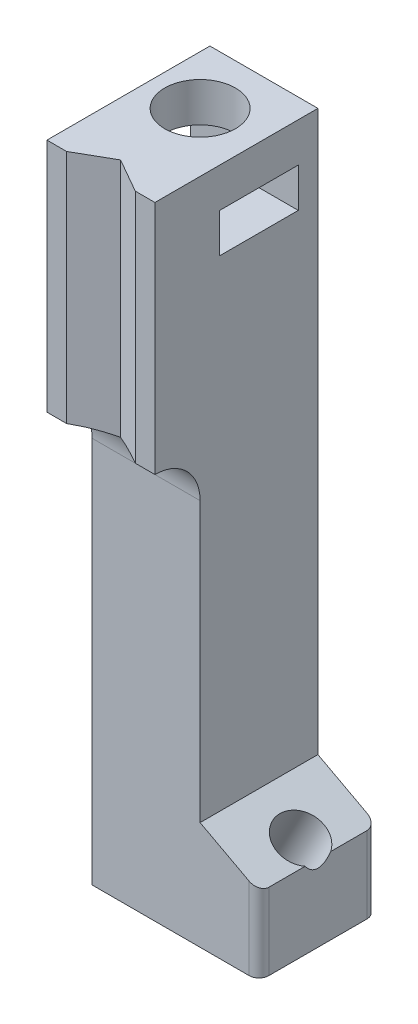
ISO-10303-21;
HEADER;
FILE_DESCRIPTION(('STEP AP214'),'2;1');
FILE_NAME('part.step','',(''),(''),'','','');
FILE_SCHEMA(('AUTOMOTIVE_DESIGN { 1 0 10303 214 1 1 1 1 }'));
ENDSEC;
DATA;
#1=APPLICATION_CONTEXT('core data for automotive mechanical design processes');
#2=APPLICATION_PROTOCOL_DEFINITION('international standard','automotive_design',2000,#1);
#3=PRODUCT_CONTEXT('',#1,'mechanical');
#4=PRODUCT('Part','Part','',(#3));
#5=PRODUCT_RELATED_PRODUCT_CATEGORY('part','',(#4));
#6=PRODUCT_DEFINITION_FORMATION('','',#4);
#7=PRODUCT_DEFINITION_CONTEXT('part definition',#1,'design');
#8=PRODUCT_DEFINITION('design','',#6,#7);
#9=PRODUCT_DEFINITION_SHAPE('','',#8);
#10=(LENGTH_UNIT() NAMED_UNIT(*) SI_UNIT(.MILLI.,.METRE.));
#11=(NAMED_UNIT(*) PLANE_ANGLE_UNIT() SI_UNIT($,.RADIAN.));
#12=(NAMED_UNIT(*) SI_UNIT($,.STERADIAN.) SOLID_ANGLE_UNIT());
#13=UNCERTAINTY_MEASURE_WITH_UNIT(LENGTH_MEASURE(1.E-05),#10,'distance_accuracy_value','');
#14=(GEOMETRIC_REPRESENTATION_CONTEXT(3) GLOBAL_UNCERTAINTY_ASSIGNED_CONTEXT((#13)) GLOBAL_UNIT_ASSIGNED_CONTEXT((#10,
#11,#12)) REPRESENTATION_CONTEXT('',''));
#15=CARTESIAN_POINT('',(0.,0.,0.));
#16=DIRECTION('',(0.,0.,1.));
#17=DIRECTION('',(1.,0.,0.));
#18=AXIS2_PLACEMENT_3D('',#15,#16,#17);
#19=CARTESIAN_POINT('',(0.,0.,2.64999999996392));
#20=DIRECTION('',(0.,0.,-1.));
#21=DIRECTION('',(-1.,0.,0.));
#22=AXIS2_PLACEMENT_3D('',#19,#20,#21);
#23=PLANE('',#22);
#24=DIRECTION('',(1.,0.,0.));
#25=VECTOR('',#24,1.);
#26=CARTESIAN_POINT('',(4.00000000001017,18.75,2.64999999996392));
#27=LINE('',#26,#25);
#28=CARTESIAN_POINT('',(1.25000000001018,18.75,2.64999999996392));
#29=VERTEX_POINT('',#28);
#30=CARTESIAN_POINT('',(1.75000000001017,18.75,2.64999999996392));
#31=VERTEX_POINT('',#30);
#32=EDGE_CURVE('E375',#29,#31,#27,.T.);
#33=ORIENTED_EDGE('',*,*,#32,.T.);
#34=DIRECTION('',(0.,1.,0.));
#35=VECTOR('',#34,1.);
#36=CARTESIAN_POINT('',(1.75000000001017,7.75,2.64999999996392));
#37=LINE('',#36,#35);
#38=CARTESIAN_POINT('',(1.75000000001017,24.75,2.64999999996392));
#39=VERTEX_POINT('',#38);
#40=EDGE_CURVE('E481',#31,#39,#37,.T.);
#41=ORIENTED_EDGE('',*,*,#40,.T.);
#42=DIRECTION('',(1.,0.,0.));
#43=VECTOR('',#42,1.);
#44=CARTESIAN_POINT('',(1.25000000001018,24.75,2.64999999996392));
#45=LINE('',#44,#43);
#46=CARTESIAN_POINT('',(1.25000000001018,24.75,2.64999999996392));
#47=VERTEX_POINT('',#46);
#48=EDGE_CURVE('E356',#47,#39,#45,.T.);
#49=ORIENTED_EDGE('',*,*,#48,.F.);
#50=DIRECTION('',(0.,-1.,0.));
#51=VECTOR('',#50,1.);
#52=CARTESIAN_POINT('',(1.25000000001018,23.75,2.64999999996392));
#53=LINE('',#52,#51);
#54=EDGE_CURVE('E371',#47,#29,#53,.T.);
#55=ORIENTED_EDGE('',*,*,#54,.T.);
#56=EDGE_LOOP('',(#33,#41,#49,#55));
#57=FACE_BOUND('',#56,.T.);
#58=ADVANCED_FACE('F39',(#57),#23,.F.);
#59=CARTESIAN_POINT('',(1.25000000001018,23.75,1.49999999996392));
#60=DIRECTION('',(0.,0.,-1.));
#61=DIRECTION('',(0.,1.,0.));
#62=AXIS2_PLACEMENT_3D('',#59,#60,#61);
#63=PLANE('',#62);
#64=DIRECTION('',(1.,0.,0.));
#65=VECTOR('',#64,1.);
#66=CARTESIAN_POINT('',(1.25000000001017,7.75,1.49999999996392));
#67=LINE('',#66,#65);
#68=CARTESIAN_POINT('',(1.25000000001017,7.75,1.49999999996392));
#69=VERTEX_POINT('',#68);
#70=CARTESIAN_POINT('',(5.25000000001017,7.75,1.49999999996392));
#71=VERTEX_POINT('',#70);
#72=EDGE_CURVE('E378',#69,#71,#67,.T.);
#73=ORIENTED_EDGE('',*,*,#72,.T.);
#74=DIRECTION('',(0.,-1.,0.));
#75=VECTOR('',#74,1.);
#76=CARTESIAN_POINT('',(5.25000000001017,9.7,1.49999999996392));
#77=LINE('',#76,#75);
#78=CARTESIAN_POINT('',(5.25000000001017,9.83333333333333,1.49999999996392));
#79=VERTEX_POINT('',#78);
#80=EDGE_CURVE('E427',#71,#79,#77,.F.);
#81=ORIENTED_EDGE('',*,*,#80,.T.);
#82=DIRECTION('',(-0.882352941176471,0.470588235294117,0.));
#83=VECTOR('',#82,1.);
#84=CARTESIAN_POINT('',(5.50000000001017,9.7,1.49999999996392));
#85=LINE('',#84,#83);
#86=CARTESIAN_POINT('',(4.00000000001017,10.5,1.49999999996392));
#87=VERTEX_POINT('',#86);
#88=EDGE_CURVE('E393',#79,#87,#85,.T.);
#89=ORIENTED_EDGE('',*,*,#88,.T.);
#90=DIRECTION('',(0.,1.,0.));
#91=VECTOR('',#90,1.);
#92=CARTESIAN_POINT('',(4.00000000001017,21.75,1.49999999996392));
#93=LINE('',#92,#91);
#94=CARTESIAN_POINT('',(4.00000000001017,17.6,1.49999999996392));
#95=VERTEX_POINT('',#94);
#96=EDGE_CURVE('E238',#87,#95,#93,.T.);
#97=ORIENTED_EDGE('',*,*,#96,.T.);
#98=DIRECTION('',(1.,0.,0.));
#99=VECTOR('',#98,1.);
#100=CARTESIAN_POINT('',(1.25000000001018,17.6,1.49999999996392));
#101=LINE('',#100,#99);
#102=CARTESIAN_POINT('',(1.25000000001018,17.6,1.49999999996392));
#103=VERTEX_POINT('',#102);
#104=EDGE_CURVE('E391',#95,#103,#101,.F.);
#105=ORIENTED_EDGE('',*,*,#104,.T.);
#106=DIRECTION('',(0.,-1.,0.));
#107=VECTOR('',#106,1.);
#108=CARTESIAN_POINT('',(1.25000000001018,23.75,1.49999999996392));
#109=LINE('',#108,#107);
#110=EDGE_CURVE('E381',#103,#69,#109,.T.);
#111=ORIENTED_EDGE('',*,*,#110,.T.);
#112=EDGE_LOOP('',(#73,#81,#89,#97,#105,#111));
#113=FACE_BOUND('',#112,.T.);
#114=ADVANCED_FACE('F277',(#113),#63,.F.);
#115=CARTESIAN_POINT('',(2.50000000000001,23.25,0.));
#116=DIRECTION('',(0.,1.,0.));
#117=DIRECTION('',(0.,0.,-1.));
#118=AXIS2_PLACEMENT_3D('',#115,#116,#117);
#119=ELLIPSE('',#118,1.3,0.65);
#120=DIRECTION('',(0.,-1.,0.));
#121=VECTOR('',#120,1.);
#122=SURFACE_OF_LINEAR_EXTRUSION('',#119,#121);
#123=DIRECTION('',(0.,-1.,0.));
#124=VECTOR('',#123,1.);
#125=CARTESIAN_POINT('',(2.91533119316764,23.25,0.999999999963918));
#126=LINE('',#125,#124);
#127=CARTESIAN_POINT('',(2.91533119316764,22.75,0.999999999963918));
#128=VERTEX_POINT('',#127);
#129=CARTESIAN_POINT('',(2.91533119316764,23.25,0.999999999963918));
#130=VERTEX_POINT('',#129);
#131=EDGE_CURVE('E525',#128,#130,#126,.F.);
#132=ORIENTED_EDGE('',*,*,#131,.F.);
#133=CARTESIAN_POINT('',(2.50000000000001,22.75,0.));
#134=DIRECTION('',(0.,1.,0.));
#135=DIRECTION('',(0.,0.,-1.));
#136=AXIS2_PLACEMENT_3D('',#133,#134,#135);
#137=ELLIPSE('',#136,1.3,0.65);
#138=CARTESIAN_POINT('',(2.08466880683238,22.75,0.999999999963918));
#139=VERTEX_POINT('',#138);
#140=EDGE_CURVE('E801',#139,#128,#137,.T.);
#141=ORIENTED_EDGE('',*,*,#140,.F.);
#142=DIRECTION('',(0.,-1.,0.));
#143=VECTOR('',#142,1.);
#144=CARTESIAN_POINT('',(2.08466880683238,23.25,0.999999999963918));
#145=LINE('',#144,#143);
#146=CARTESIAN_POINT('',(2.08466880683238,23.25,0.999999999963918));
#147=VERTEX_POINT('',#146);
#148=EDGE_CURVE('E523',#147,#139,#145,.T.);
#149=ORIENTED_EDGE('',*,*,#148,.F.);
#150=EDGE_CURVE('E264',#147,#130,#119,.T.);
#151=ORIENTED_EDGE('',*,*,#150,.T.);
#152=EDGE_LOOP('',(#132,#141,#149,#151));
#153=FACE_BOUND('',#152,.T.);
#154=ADVANCED_FACE('F272',(#153),#122,.T.);
#155=DIRECTION('',(0.,-1.,0.));
#156=VECTOR('',#155,1.);
#157=CARTESIAN_POINT('',(2.08466880687584,23.25,-1.00000000003608));
#158=LINE('',#157,#156);
#159=CARTESIAN_POINT('',(2.08466880687584,22.75,-1.00000000003608));
#160=VERTEX_POINT('',#159);
#161=CARTESIAN_POINT('',(2.08466880687584,23.25,-1.00000000003608));
#162=VERTEX_POINT('',#161);
#163=EDGE_CURVE('E532',#160,#162,#158,.F.);
#164=ORIENTED_EDGE('',*,*,#163,.F.);
#165=CARTESIAN_POINT('',(2.91533119312418,22.75,-1.00000000003608));
#166=VERTEX_POINT('',#165);
#167=EDGE_CURVE('E263',#166,#160,#137,.T.);
#168=ORIENTED_EDGE('',*,*,#167,.F.);
#169=DIRECTION('',(0.,-1.,0.));
#170=VECTOR('',#169,1.);
#171=CARTESIAN_POINT('',(2.91533119312418,23.25,-1.00000000003608));
#172=LINE('',#171,#170);
#173=CARTESIAN_POINT('',(2.91533119312418,23.25,-1.00000000003608));
#174=VERTEX_POINT('',#173);
#175=EDGE_CURVE('E530',#174,#166,#172,.T.);
#176=ORIENTED_EDGE('',*,*,#175,.F.);
#177=EDGE_CURVE('E269',#174,#162,#119,.T.);
#178=ORIENTED_EDGE('',*,*,#177,.T.);
#179=EDGE_LOOP('',(#164,#168,#176,#178));
#180=FACE_BOUND('',#179,.T.);
#181=ADVANCED_FACE('F276',(#180),#122,.T.);
#182=CARTESIAN_POINT('',(0.,22.75,0.));
#183=DIRECTION('',(0.,1.,0.));
#184=DIRECTION('',(-1.,0.,0.));
#185=AXIS2_PLACEMENT_3D('',#182,#183,#184);
#186=PLANE('',#185);
#187=ORIENTED_EDGE('',*,*,#140,.T.);
#188=DIRECTION('',(-1.,0.,0.));
#189=VECTOR('',#188,1.);
#190=CARTESIAN_POINT('',(5.50000000001017,22.75,0.999999999963918));
#191=LINE('',#190,#189);
#192=CARTESIAN_POINT('',(4.00000000001017,22.75,0.999999999963918));
#193=VERTEX_POINT('',#192);
#194=EDGE_CURVE('E508',#193,#128,#191,.T.);
#195=ORIENTED_EDGE('',*,*,#194,.F.);
#196=DIRECTION('',(0.,0.,-1.));
#197=VECTOR('',#196,1.);
#198=CARTESIAN_POINT('',(4.00000000001017,22.75,1.99999999996392));
#199=LINE('',#198,#197);
#200=CARTESIAN_POINT('',(4.00000000001017,22.75,-1.00000000003608));
#201=VERTEX_POINT('',#200);
#202=EDGE_CURVE('E518',#193,#201,#199,.T.);
#203=ORIENTED_EDGE('',*,*,#202,.T.);
#204=DIRECTION('',(-1.,0.,0.));
#205=VECTOR('',#204,1.);
#206=CARTESIAN_POINT('',(5.50000000001017,22.75,-1.00000000003608));
#207=LINE('',#206,#205);
#208=EDGE_CURVE('E512',#201,#166,#207,.T.);
#209=ORIENTED_EDGE('',*,*,#208,.T.);
#210=ORIENTED_EDGE('',*,*,#167,.T.);
#211=CARTESIAN_POINT('',(1.25000000001017,22.75,-1.00000000003608));
#212=VERTEX_POINT('',#211);
#213=EDGE_CURVE('E502',#160,#212,#207,.T.);
#214=ORIENTED_EDGE('',*,*,#213,.T.);
#215=DIRECTION('',(0.,0.,1.));
#216=VECTOR('',#215,1.);
#217=CARTESIAN_POINT('',(1.25000000001017,22.75,-1.00000000003608));
#218=LINE('',#217,#216);
#219=CARTESIAN_POINT('',(1.25000000001017,22.75,0.999999999963918));
#220=VERTEX_POINT('',#219);
#221=EDGE_CURVE('E488',#212,#220,#218,.T.);
#222=ORIENTED_EDGE('',*,*,#221,.T.);
#223=EDGE_CURVE('E509',#139,#220,#191,.T.);
#224=ORIENTED_EDGE('',*,*,#223,.F.);
#225=EDGE_LOOP('',(#187,#195,#203,#209,#210,#214,#222,#224));
#226=FACE_BOUND('',#225,.T.);
#227=CARTESIAN_POINT('',(2.50000000000001,22.75,0.));
#228=DIRECTION('',(0.,1.,0.));
#229=DIRECTION('',(-1.,0.,0.));
#230=AXIS2_PLACEMENT_3D('',#227,#228,#229);
#231=CIRCLE('',#230,0.425);
#232=CARTESIAN_POINT('',(2.07500000000001,22.75,0.));
#233=VERTEX_POINT('',#232);
#234=EDGE_CURVE('E268',#233,#233,#231,.T.);
#235=ORIENTED_EDGE('',*,*,#234,.F.);
#236=EDGE_LOOP('',(#235));
#237=FACE_BOUND('',#236,.T.);
#238=ADVANCED_FACE('F284',(#226,#237),#186,.T.);
#239=CARTESIAN_POINT('',(2.50000000000001,22.75,0.));
#240=DIRECTION('',(0.,-1.,0.));
#241=DIRECTION('',(1.,0.,0.));
#242=AXIS2_PLACEMENT_3D('',#239,#240,#241);
#243=CYLINDRICAL_SURFACE('',#242,0.425);
#244=ORIENTED_EDGE('',*,*,#234,.T.);
#245=EDGE_LOOP('',(#244));
#246=FACE_BOUND('',#245,.T.);
#247=CARTESIAN_POINT('',(2.50000000000001,21.75,0.));
#248=DIRECTION('',(0.,1.,0.));
#249=DIRECTION('',(-1.,0.,0.));
#250=AXIS2_PLACEMENT_3D('',#247,#248,#249);
#251=CIRCLE('',#250,0.425);
#252=CARTESIAN_POINT('',(2.07500000000001,21.75,0.));
#253=VERTEX_POINT('',#252);
#254=EDGE_CURVE('E255',#253,#253,#251,.T.);
#255=ORIENTED_EDGE('',*,*,#254,.F.);
#256=EDGE_LOOP('',(#255));
#257=FACE_BOUND('',#256,.T.);
#258=ADVANCED_FACE('F281',(#246,#257),#243,.F.);
#259=CARTESIAN_POINT('',(0.,23.25,0.));
#260=DIRECTION('',(0.,1.,0.));
#261=DIRECTION('',(0.,0.,1.));
#262=AXIS2_PLACEMENT_3D('',#259,#260,#261);
#263=PLANE('',#262);
#264=ORIENTED_EDGE('',*,*,#150,.F.);
#265=DIRECTION('',(1.,0.,0.));
#266=VECTOR('',#265,1.);
#267=CARTESIAN_POINT('',(0.,23.25,0.999999999963918));
#268=LINE('',#267,#266);
#269=EDGE_CURVE('E520',#147,#130,#268,.T.);
#270=ORIENTED_EDGE('',*,*,#269,.T.);
#271=EDGE_LOOP('',(#264,#270));
#272=FACE_BOUND('',#271,.T.);
#273=ADVANCED_FACE('F279',(#272),#263,.F.);
#274=ORIENTED_EDGE('',*,*,#177,.F.);
#275=DIRECTION('',(-1.,0.,0.));
#276=VECTOR('',#275,1.);
#277=CARTESIAN_POINT('',(0.,23.25,-1.00000000003608));
#278=LINE('',#277,#276);
#279=EDGE_CURVE('E527',#174,#162,#278,.T.);
#280=ORIENTED_EDGE('',*,*,#279,.T.);
#281=EDGE_LOOP('',(#274,#280));
#282=FACE_BOUND('',#281,.T.);
#283=ADVANCED_FACE('F293',(#282),#263,.F.);
#284=CARTESIAN_POINT('',(0.,7.75,0.));
#285=DIRECTION('',(0.,1.,0.));
#286=DIRECTION('',(0.,0.,1.));
#287=AXIS2_PLACEMENT_3D('',#284,#285,#286);
#288=PLANE('',#287);
#289=CARTESIAN_POINT('',(2.5,7.75,0.));
#290=DIRECTION('',(0.,1.,0.));
#291=DIRECTION('',(0.,0.,1.));
#292=AXIS2_PLACEMENT_3D('',#289,#290,#291);
#293=CIRCLE('',#292,0.825000000000001);
#294=CARTESIAN_POINT('',(2.47513758544198,7.75,0.824625284806587));
#295=VERTEX_POINT('',#294);
#296=CARTESIAN_POINT('',(3.28350083011511,7.75,0.258363018268752));
#297=VERTEX_POINT('',#296);
#298=EDGE_CURVE('E437',#295,#297,#293,.T.);
#299=ORIENTED_EDGE('',*,*,#298,.T.);
#300=CARTESIAN_POINT('',(3.89333333334351,7.75,0.));
#301=DIRECTION('',(0.,1.,0.));
#302=DIRECTION('',(1.,0.,0.));
#303=AXIS2_PLACEMENT_3D('',#300,#301,#302);
#304=ELLIPSE('',#303,0.676486666600938,0.596899999942004);
#305=CARTESIAN_POINT('',(3.28350083011511,7.75,-0.258363018268751));
#306=VERTEX_POINT('',#305);
#307=EDGE_CURVE('E53',#297,#306,#304,.T.);
#308=ORIENTED_EDGE('',*,*,#307,.T.);
#309=CARTESIAN_POINT('',(2.47513758544198,7.75,-0.824625284806589));
#310=VERTEX_POINT('',#309);
#311=EDGE_CURVE('E460',#306,#310,#293,.T.);
#312=ORIENTED_EDGE('',*,*,#311,.T.);
#313=DIRECTION('',(-0.99954579976556,0.,0.0301362600703328));
#314=VECTOR('',#313,1.);
#315=CARTESIAN_POINT('',(-0.0225919291304578,7.75,-0.74931885437173));
#316=LINE('',#315,#314);
#317=CARTESIAN_POINT('',(1.25000000001017,7.75,-0.787687442733547));
#318=VERTEX_POINT('',#317);
#319=EDGE_CURVE('E257',#310,#318,#316,.T.);
#320=ORIENTED_EDGE('',*,*,#319,.T.);
#321=DIRECTION('',(0.,0.,-1.));
#322=VECTOR('',#321,1.);
#323=CARTESIAN_POINT('',(1.25000000001017,7.75,1.99999999996392));
#324=LINE('',#323,#322);
#325=CARTESIAN_POINT('',(1.25000000001017,7.75,-1.50000000003608));
#326=VERTEX_POINT('',#325);
#327=EDGE_CURVE('E452',#318,#326,#324,.T.);
#328=ORIENTED_EDGE('',*,*,#327,.T.);
#329=DIRECTION('',(-1.,0.,0.));
#330=VECTOR('',#329,1.);
#331=CARTESIAN_POINT('',(1.25000000001017,7.75,-1.50000000003608));
#332=LINE('',#331,#330);
#333=CARTESIAN_POINT('',(5.25000000001017,7.75,-1.50000000003608));
#334=VERTEX_POINT('',#333);
#335=EDGE_CURVE('E377',#334,#326,#332,.T.);
#336=ORIENTED_EDGE('',*,*,#335,.F.);
#337=CARTESIAN_POINT('',(5.25000000001017,7.75,-1.25000000003608));
#338=DIRECTION('',(0.,1.,0.));
#339=DIRECTION('',(0.,0.,1.));
#340=AXIS2_PLACEMENT_3D('',#337,#338,#339);
#341=CIRCLE('',#340,0.25);
#342=CARTESIAN_POINT('',(5.50000000001017,7.75,-1.25000000003608));
#343=VERTEX_POINT('',#342);
#344=EDGE_CURVE('E423',#334,#343,#341,.F.);
#345=ORIENTED_EDGE('',*,*,#344,.T.);
#346=DIRECTION('',(0.,0.,1.));
#347=VECTOR('',#346,1.);
#348=CARTESIAN_POINT('',(5.50000000001017,7.75,-5.13249102147965));
#349=LINE('',#348,#347);
#350=CARTESIAN_POINT('',(5.50000000001017,7.75,1.24999999996392));
#351=VERTEX_POINT('',#350);
#352=EDGE_CURVE('E234',#343,#351,#349,.T.);
#353=ORIENTED_EDGE('',*,*,#352,.T.);
#354=CARTESIAN_POINT('',(5.25000000001017,7.75,1.24999999996392));
#355=DIRECTION('',(0.,1.,0.));
#356=DIRECTION('',(0.,0.,1.));
#357=AXIS2_PLACEMENT_3D('',#354,#355,#356);
#358=CIRCLE('',#357,0.25);
#359=EDGE_CURVE('E425',#351,#71,#358,.F.);
#360=ORIENTED_EDGE('',*,*,#359,.T.);
#361=ORIENTED_EDGE('',*,*,#72,.F.);
#362=CARTESIAN_POINT('',(1.25000000001017,7.75,0.787687442733547));
#363=VERTEX_POINT('',#362);
#364=EDGE_CURVE('E446',#69,#363,#324,.T.);
#365=ORIENTED_EDGE('',*,*,#364,.T.);
#366=DIRECTION('',(0.99954579976556,0.,0.0301362600703316));
#367=VECTOR('',#366,1.);
#368=CARTESIAN_POINT('',(-0.0225919291304569,7.75,0.749318854371731));
#369=LINE('',#368,#367);
#370=EDGE_CURVE('E260',#363,#295,#369,.T.);
#371=ORIENTED_EDGE('',*,*,#370,.T.);
#372=EDGE_LOOP('',(#299,#308,#312,#320,#328,#336,#345,#353,#360,#361,#365,#371));
#373=FACE_BOUND('',#372,.T.);
#374=ADVANCED_FACE('F289',(#373),#288,.F.);
#375=CARTESIAN_POINT('',(1.25000000001017,21.75,1.99999999996392));
#376=DIRECTION('',(-1.,0.,0.));
#377=DIRECTION('',(0.,0.,1.));
#378=AXIS2_PLACEMENT_3D('',#375,#376,#377);
#379=PLANE('',#378);
#380=DIRECTION('',(0.,-1.,0.));
#381=VECTOR('',#380,1.);
#382=CARTESIAN_POINT('',(1.25000000001017,22.75,-1.00000000003608));
#383=LINE('',#382,#381);
#384=CARTESIAN_POINT('',(1.25000000001017,23.75,-1.00000000003608));
#385=VERTEX_POINT('',#384);
#386=EDGE_CURVE('E484',#385,#212,#383,.T.);
#387=ORIENTED_EDGE('',*,*,#386,.F.);
#388=DIRECTION('',(0.,0.,-1.));
#389=VECTOR('',#388,1.);
#390=CARTESIAN_POINT('',(1.25000000001017,23.75,-1.00000000003608));
#391=LINE('',#390,#389);
#392=CARTESIAN_POINT('',(1.25000000001017,23.75,0.999999999963918));
#393=VERTEX_POINT('',#392);
#394=EDGE_CURVE('E499',#393,#385,#391,.T.);
#395=ORIENTED_EDGE('',*,*,#394,.F.);
#396=DIRECTION('',(0.,1.,0.));
#397=VECTOR('',#396,1.);
#398=CARTESIAN_POINT('',(1.25000000001017,22.75,0.999999999963918));
#399=LINE('',#398,#397);
#400=EDGE_CURVE('E496',#220,#393,#399,.T.);
#401=ORIENTED_EDGE('',*,*,#400,.F.);
#402=ORIENTED_EDGE('',*,*,#221,.F.);
#403=EDGE_LOOP('',(#387,#395,#401,#402));
#404=FACE_BOUND('',#403,.T.);
#405=ORIENTED_EDGE('',*,*,#110,.F.);
#406=CARTESIAN_POINT('',(1.25000000001017,17.6,2.64999999996392));
#407=DIRECTION('',(-1.,0.,0.));
#408=DIRECTION('',(0.,0.,1.));
#409=AXIS2_PLACEMENT_3D('',#406,#407,#408);
#410=CIRCLE('',#409,1.15);
#411=EDGE_CURVE('E402',#103,#29,#410,.F.);
#412=ORIENTED_EDGE('',*,*,#411,.T.);
#413=ORIENTED_EDGE('',*,*,#54,.F.);
#414=DIRECTION('',(0.,0.,1.));
#415=VECTOR('',#414,1.);
#416=CARTESIAN_POINT('',(1.25000000001018,24.75,-1.50000000003608));
#417=LINE('',#416,#415);
#418=CARTESIAN_POINT('',(1.25000000001018,24.75,-1.50000000003608));
#419=VERTEX_POINT('',#418);
#420=EDGE_CURVE('E357',#419,#47,#417,.T.);
#421=ORIENTED_EDGE('',*,*,#420,.F.);
#422=DIRECTION('',(0.,-1.,0.));
#423=VECTOR('',#422,1.);
#424=CARTESIAN_POINT('',(1.25000000001018,23.75,-1.50000000003608));
#425=LINE('',#424,#423);
#426=EDGE_CURVE('E382',#419,#326,#425,.T.);
#427=ORIENTED_EDGE('',*,*,#426,.T.);
#428=ORIENTED_EDGE('',*,*,#327,.F.);
#429=DIRECTION('',(0.,-1.,0.));
#430=VECTOR('',#429,1.);
#431=CARTESIAN_POINT('',(1.25000000001017,21.75,-0.787687442733547));
#432=LINE('',#431,#430);
#433=CARTESIAN_POINT('',(1.25000000001017,21.75,-0.787687442733547));
#434=VERTEX_POINT('',#433);
#435=EDGE_CURVE('E454',#434,#318,#432,.T.);
#436=ORIENTED_EDGE('',*,*,#435,.F.);
#437=DIRECTION('',(0.,0.,1.));
#438=VECTOR('',#437,1.);
#439=CARTESIAN_POINT('',(1.25000000001017,21.75,1.99999999996392));
#440=LINE('',#439,#438);
#441=CARTESIAN_POINT('',(1.25000000001017,21.75,0.787687442733547));
#442=VERTEX_POINT('',#441);
#443=EDGE_CURVE('E451',#434,#442,#440,.T.);
#444=ORIENTED_EDGE('',*,*,#443,.T.);
#445=DIRECTION('',(0.,1.,0.));
#446=VECTOR('',#445,1.);
#447=CARTESIAN_POINT('',(1.25000000001017,21.75,0.787687442733547));
#448=LINE('',#447,#446);
#449=EDGE_CURVE('E449',#363,#442,#448,.T.);
#450=ORIENTED_EDGE('',*,*,#449,.F.);
#451=ORIENTED_EDGE('',*,*,#364,.F.);
#452=EDGE_LOOP('',(#405,#412,#413,#421,#427,#428,#436,#444,#450,#451));
#453=FACE_BOUND('',#452,.T.);
#454=ADVANCED_FACE('F292',(#404,#453),#379,.T.);
#455=CARTESIAN_POINT('',(4.00000000001017,21.75,1.99999999996392));
#456=DIRECTION('',(1.,0.,0.));
#457=DIRECTION('',(0.,0.,-1.));
#458=AXIS2_PLACEMENT_3D('',#455,#456,#457);
#459=PLANE('',#458);
#460=DIRECTION('',(0.,1.,0.));
#461=VECTOR('',#460,1.);
#462=CARTESIAN_POINT('',(4.00000000001017,21.75,-1.00000000003608));
#463=LINE('',#462,#461);
#464=CARTESIAN_POINT('',(4.00000000001017,23.75,-1.00000000003608));
#465=VERTEX_POINT('',#464);
#466=EDGE_CURVE('E412',#201,#465,#463,.T.);
#467=ORIENTED_EDGE('',*,*,#466,.F.);
#468=ORIENTED_EDGE('',*,*,#202,.F.);
#469=DIRECTION('',(0.,-1.,0.));
#470=VECTOR('',#469,1.);
#471=CARTESIAN_POINT('',(4.00000000001017,21.75,0.999999999963918));
#472=LINE('',#471,#470);
#473=CARTESIAN_POINT('',(4.00000000001017,23.75,0.999999999963918));
#474=VERTEX_POINT('',#473);
#475=EDGE_CURVE('E410',#474,#193,#472,.T.);
#476=ORIENTED_EDGE('',*,*,#475,.F.);
#477=DIRECTION('',(0.,0.,1.));
#478=VECTOR('',#477,1.);
#479=CARTESIAN_POINT('',(4.00000000001017,23.75,1.99999999996392));
#480=LINE('',#479,#478);
#481=EDGE_CURVE('E516',#465,#474,#480,.T.);
#482=ORIENTED_EDGE('',*,*,#481,.F.);
#483=EDGE_LOOP('',(#467,#468,#476,#482));
#484=FACE_BOUND('',#483,.T.);
#485=ORIENTED_EDGE('',*,*,#96,.F.);
#486=DIRECTION('',(0.,0.,1.));
#487=VECTOR('',#486,1.);
#488=CARTESIAN_POINT('',(4.00000000001017,10.5,-5.13249102147965));
#489=LINE('',#488,#487);
#490=CARTESIAN_POINT('',(4.00000000001017,10.5,-1.50000000003608));
#491=VERTEX_POINT('',#490);
#492=EDGE_CURVE('E236',#491,#87,#489,.T.);
#493=ORIENTED_EDGE('',*,*,#492,.F.);
#494=DIRECTION('',(0.,-1.,0.));
#495=VECTOR('',#494,1.);
#496=CARTESIAN_POINT('',(4.00000000001017,21.75,-1.50000000003608));
#497=LINE('',#496,#495);
#498=CARTESIAN_POINT('',(4.00000000001017,24.75,-1.50000000003608));
#499=VERTEX_POINT('',#498);
#500=EDGE_CURVE('E384',#499,#491,#497,.T.);
#501=ORIENTED_EDGE('',*,*,#500,.F.);
#502=DIRECTION('',(0.,0.,-1.));
#503=VECTOR('',#502,1.);
#504=CARTESIAN_POINT('',(4.00000000001017,24.75,-1.50000000003608));
#505=LINE('',#504,#503);
#506=CARTESIAN_POINT('',(4.00000000001017,24.75,2.64999999996392));
#507=VERTEX_POINT('',#506);
#508=EDGE_CURVE('E360',#507,#499,#505,.T.);
#509=ORIENTED_EDGE('',*,*,#508,.F.);
#510=DIRECTION('',(0.,1.,0.));
#511=VECTOR('',#510,1.);
#512=CARTESIAN_POINT('',(4.00000000001017,23.75,2.64999999996392));
#513=LINE('',#512,#511);
#514=CARTESIAN_POINT('',(4.00000000001017,18.75,2.64999999996392));
#515=VERTEX_POINT('',#514);
#516=EDGE_CURVE('E352',#515,#507,#513,.T.);
#517=ORIENTED_EDGE('',*,*,#516,.F.);
#518=CARTESIAN_POINT('',(4.00000000001017,17.6,2.64999999996392));
#519=DIRECTION('',(1.,0.,0.));
#520=DIRECTION('',(0.,0.,-1.));
#521=AXIS2_PLACEMENT_3D('',#518,#519,#520);
#522=CIRCLE('',#521,1.15);
#523=EDGE_CURVE('E400',#515,#95,#522,.F.);
#524=ORIENTED_EDGE('',*,*,#523,.T.);
#525=EDGE_LOOP('',(#485,#493,#501,#509,#517,#524));
#526=FACE_BOUND('',#525,.T.);
#527=ADVANCED_FACE('F295',(#484,#526),#459,.T.);
#528=CARTESIAN_POINT('',(2.5,2.75,0.));
#529=DIRECTION('',(0.,1.,0.));
#530=DIRECTION('',(0.,0.,1.));
#531=AXIS2_PLACEMENT_3D('',#528,#529,#530);
#532=CYLINDRICAL_SURFACE('',#531,0.825000000000001);
#533=ORIENTED_EDGE('',*,*,#311,.F.);
#534=CARTESIAN_POINT('',(3.28350083011511,7.75,-0.258363018268751));
#535=CARTESIAN_POINT('',(3.28699629386318,7.76737167610386,-0.247717695795739));
#536=CARTESIAN_POINT('',(3.29045746397856,7.78448758146414,-0.236535022142882));
#537=CARTESIAN_POINT('',(3.29729263029283,7.81815195159373,-0.212408271554127));
#538=CARTESIAN_POINT('',(3.30066185739445,7.83467320491001,-0.199425248176803));
#539=CARTESIAN_POINT('',(3.30711403044603,7.86619807139703,-0.171461122570828));
#540=CARTESIAN_POINT('',(3.3101953340927,7.88119301733646,-0.156469620021036));
#541=CARTESIAN_POINT('',(3.31577706571615,7.90827880066202,-0.124090209152378));
#542=CARTESIAN_POINT('',(3.31828357965726,7.92040011589495,-0.106730843363556));
#543=CARTESIAN_POINT('',(3.32127084558138,7.9348215765627,-0.0788883192918905));
#544=CARTESIAN_POINT('',(3.32213260135721,7.93897685197716,-0.0694173488184383));
#545=CARTESIAN_POINT('',(3.32354615738824,7.94578891480867,-0.0499200886747981));
#546=CARTESIAN_POINT('',(3.32409815277136,7.94844664558094,-0.0398941529782825));
#547=CARTESIAN_POINT('',(3.32483491132341,7.95199328219456,-0.0194333412467646));
#548=CARTESIAN_POINT('',(3.32501688143136,7.9528687349283,-0.00899595677292683));
#549=CARTESIAN_POINT('',(3.32498062707693,7.95269427559984,0.0118633448697014));
#550=CARTESIAN_POINT('',(3.3247623547405,7.95164413321211,0.0222852600389366));
#551=CARTESIAN_POINT('',(3.32398893632226,7.94792075450384,0.0419008258318336));
#552=CARTESIAN_POINT('',(3.32346365554792,7.94539140172208,0.0511240747169394));
#553=CARTESIAN_POINT('',(3.32215104739102,7.93906567007573,0.0690934351013605));
#554=CARTESIAN_POINT('',(3.32136374259963,7.93526940044204,0.077839587659306));
#555=CARTESIAN_POINT('',(3.31897190754394,7.9237240253382,0.100578862908204));
#556=CARTESIAN_POINT('',(3.31717642734045,7.91504579337111,0.114077082987651));
#557=CARTESIAN_POINT('',(3.31319719530162,7.89576674373529,0.139658737731793));
#558=CARTESIAN_POINT('',(3.31101040177495,7.88515085059979,0.151729761073551));
#559=CARTESIAN_POINT('',(3.30488396314836,7.8553267768583,0.182105092880802));
#560=CARTESIAN_POINT('',(3.30073520753249,7.83504904238653,0.19930638654706));
#561=CARTESIAN_POINT('',(3.29433648114911,7.80360095863935,0.222974308083465));
#562=CARTESIAN_POINT('',(3.29220407060575,7.79309406405001,0.230421520605261));
#563=CARTESIAN_POINT('',(3.28788815438002,7.77176907325318,0.244771662623248));
#564=CARTESIAN_POINT('',(3.28570481309643,7.76095195786055,0.251676094384232));
#565=CARTESIAN_POINT('',(3.28350083011511,7.75,0.258363018268753));
#566=B_SPLINE_CURVE_WITH_KNOTS('',3,(#534,#535,#536,#537,#538,#539,#540,#541,#542,#543,#544,
#545,#546,#547,#548,#549,#550,#551,#552,#553,#554,#555,#556,#557,#558,#559,#560,#561,#562,#563,
#564,#565),.UNSPECIFIED.,.F.,.F.,(4,2,2,2,2,2,2,2,2,2,2,2,2,2,2,4),(0.,0.0620942702647678,
0.125840542327225,0.189930676463523,0.253307172073214,0.284338947974835,0.315351153969689,
0.346596593157479,0.377845769939036,0.406467691734569,0.43508714644561,0.483247703954786,
0.531800305579686,0.612190537944451,0.651346958262201,0.690390881410292),.UNSPECIFIED.);
#567=EDGE_CURVE('E228',#306,#297,#566,.T.);
#568=ORIENTED_EDGE('',*,*,#567,.T.);
#569=ORIENTED_EDGE('',*,*,#298,.F.);
#570=DIRECTION('',(0.,1.,0.));
#571=VECTOR('',#570,1.);
#572=CARTESIAN_POINT('',(2.47513758544198,2.75,0.824625284806587));
#573=LINE('',#572,#571);
#574=CARTESIAN_POINT('',(2.47513758544198,21.75,0.824625284806587));
#575=VERTEX_POINT('',#574);
#576=EDGE_CURVE('E253',#295,#575,#573,.T.);
#577=ORIENTED_EDGE('',*,*,#576,.T.);
#578=CARTESIAN_POINT('',(2.5,21.75,0.));
#579=DIRECTION('',(0.,1.,0.));
#580=DIRECTION('',(0.,0.,-1.));
#581=AXIS2_PLACEMENT_3D('',#578,#579,#580);
#582=CIRCLE('',#581,0.825000000000001);
#583=CARTESIAN_POINT('',(2.47513758544198,21.75,-0.824625284806589));
#584=VERTEX_POINT('',#583);
#585=EDGE_CURVE('E243',#575,#584,#582,.T.);
#586=ORIENTED_EDGE('',*,*,#585,.T.);
#587=DIRECTION('',(0.,1.,0.));
#588=VECTOR('',#587,1.);
#589=CARTESIAN_POINT('',(2.47513758544198,2.75,-0.824625284806589));
#590=LINE('',#589,#588);
#591=EDGE_CURVE('E252',#310,#584,#590,.T.);
#592=ORIENTED_EDGE('',*,*,#591,.F.);
#593=EDGE_LOOP('',(#533,#568,#569,#577,#586,#592));
#594=FACE_BOUND('',#593,.T.);
#595=ADVANCED_FACE('F298',(#594),#532,.F.);
#596=CARTESIAN_POINT('',(0.,2.75,0.750000000000001));
#597=DIRECTION('',(-0.0301362600703316,0.,0.99954579976556));
#598=DIRECTION('',(0.99954579976556,0.,0.0301362600703316));
#599=AXIS2_PLACEMENT_3D('',#596,#597,#598);
#600=PLANE('',#599);
#601=ORIENTED_EDGE('',*,*,#449,.T.);
#602=DIRECTION('',(0.99954579976556,0.,0.0301362600703316));
#603=VECTOR('',#602,1.);
#604=CARTESIAN_POINT('',(0.,21.75,0.750000000000001));
#605=LINE('',#604,#603);
#606=EDGE_CURVE('E249',#442,#575,#605,.T.);
#607=ORIENTED_EDGE('',*,*,#606,.T.);
#608=ORIENTED_EDGE('',*,*,#576,.F.);
#609=ORIENTED_EDGE('',*,*,#370,.F.);
#610=EDGE_LOOP('',(#601,#607,#608,#609));
#611=FACE_BOUND('',#610,.T.);
#612=ADVANCED_FACE('F569',(#611),#600,.F.);
#613=CARTESIAN_POINT('',(0.,2.75,-0.75));
#614=DIRECTION('',(-0.0301362600703328,0.,-0.99954579976556));
#615=DIRECTION('',(-0.99954579976556,0.,0.0301362600703328));
#616=AXIS2_PLACEMENT_3D('',#613,#614,#615);
#617=PLANE('',#616);
#618=ORIENTED_EDGE('',*,*,#591,.T.);
#619=DIRECTION('',(-0.99954579976556,0.,0.0301362600703328));
#620=VECTOR('',#619,1.);
#621=CARTESIAN_POINT('',(0.,21.75,-0.75));
#622=LINE('',#621,#620);
#623=EDGE_CURVE('E246',#584,#434,#622,.T.);
#624=ORIENTED_EDGE('',*,*,#623,.T.);
#625=ORIENTED_EDGE('',*,*,#435,.T.);
#626=ORIENTED_EDGE('',*,*,#319,.F.);
#627=EDGE_LOOP('',(#618,#624,#625,#626));
#628=FACE_BOUND('',#627,.T.);
#629=ADVANCED_FACE('F467',(#628),#617,.F.);
#630=CARTESIAN_POINT('',(2.5,21.75,0.));
#631=DIRECTION('',(0.,-1.,0.));
#632=DIRECTION('',(0.,0.,-1.));
#633=AXIS2_PLACEMENT_3D('',#630,#631,#632);
#634=PLANE('',#633);
#635=ORIENTED_EDGE('',*,*,#623,.F.);
#636=ORIENTED_EDGE('',*,*,#585,.F.);
#637=ORIENTED_EDGE('',*,*,#606,.F.);
#638=ORIENTED_EDGE('',*,*,#443,.F.);
#639=EDGE_LOOP('',(#635,#636,#637,#638));
#640=FACE_BOUND('',#639,.T.);
#641=ORIENTED_EDGE('',*,*,#254,.T.);
#642=EDGE_LOOP('',(#641));
#643=FACE_BOUND('',#642,.T.);
#644=ADVANCED_FACE('F473',(#640,#643),#634,.T.);
#645=CARTESIAN_POINT('',(5.50000000001017,7.75,-5.13249102147965));
#646=DIRECTION('',(1.,0.,0.));
#647=DIRECTION('',(0.,0.,-1.));
#648=AXIS2_PLACEMENT_3D('',#645,#646,#647);
#649=PLANE('',#648);
#650=CARTESIAN_POINT('',(5.50000000001017,10.7625,0.));
#651=DIRECTION('',(1.,0.,0.));
#652=DIRECTION('',(0.,1.,0.));
#653=AXIS2_PLACEMENT_3D('',#650,#651,#652);
#654=ELLIPSE('',#653,1.26841249987676,0.596899999942004);
#655=CARTESIAN_POINT('',(5.50000000001017,9.7,0.326020873458687));
#656=VERTEX_POINT('',#655);
#657=CARTESIAN_POINT('',(5.50000000001017,9.7,-0.326020873458687));
#658=VERTEX_POINT('',#657);
#659=EDGE_CURVE('E60',#656,#658,#654,.T.);
#660=ORIENTED_EDGE('',*,*,#659,.F.);
#661=DIRECTION('',(0.,0.,1.));
#662=VECTOR('',#661,1.);
#663=CARTESIAN_POINT('',(5.50000000001017,9.7,-5.13249102147965));
#664=LINE('',#663,#662);
#665=CARTESIAN_POINT('',(5.50000000001017,9.7,1.24999999996392));
#666=VERTEX_POINT('',#665);
#667=EDGE_CURVE('E225',#656,#666,#664,.T.);
#668=ORIENTED_EDGE('',*,*,#667,.T.);
#669=DIRECTION('',(0.,-1.,0.));
#670=VECTOR('',#669,1.);
#671=CARTESIAN_POINT('',(5.50000000001017,7.75,1.24999999996392));
#672=LINE('',#671,#670);
#673=EDGE_CURVE('E421',#666,#351,#672,.T.);
#674=ORIENTED_EDGE('',*,*,#673,.T.);
#675=ORIENTED_EDGE('',*,*,#352,.F.);
#676=DIRECTION('',(0.,-1.,0.));
#677=VECTOR('',#676,1.);
#678=CARTESIAN_POINT('',(5.50000000001017,9.7,-1.25000000003608));
#679=LINE('',#678,#677);
#680=CARTESIAN_POINT('',(5.50000000001017,9.7,-1.25000000003608));
#681=VERTEX_POINT('',#680);
#682=EDGE_CURVE('E419',#343,#681,#679,.F.);
#683=ORIENTED_EDGE('',*,*,#682,.T.);
#684=EDGE_CURVE('E227',#681,#658,#664,.T.);
#685=ORIENTED_EDGE('',*,*,#684,.T.);
#686=EDGE_LOOP('',(#660,#668,#674,#675,#683,#685));
#687=FACE_BOUND('',#686,.T.);
#688=ADVANCED_FACE('F223',(#687),#649,.T.);
#689=CARTESIAN_POINT('',(5.50000000001017,9.7,-5.13249102147965));
#690=DIRECTION('',(0.470588235294117,0.882352941176471,0.));
#691=DIRECTION('',(-0.882352941176471,0.470588235294117,0.));
#692=AXIS2_PLACEMENT_3D('',#689,#690,#691);
#693=PLANE('',#692);
#694=CARTESIAN_POINT('',(5.05882352942194,9.93529411764706,0.));
#695=DIRECTION('',(0.470588235294117,0.882352941176471,0.));
#696=DIRECTION('',(-0.882352941176471,0.470588235294117,0.));
#697=AXIS2_PLACEMENT_3D('',#694,#695,#696);
#698=CIRCLE('',#697,0.596899999942004);
#699=EDGE_CURVE('E215',#658,#656,#698,.T.);
#700=ORIENTED_EDGE('',*,*,#699,.F.);
#701=ORIENTED_EDGE('',*,*,#684,.F.);
#702=CARTESIAN_POINT('',(5.25000000001017,9.83333333333333,-1.25000000003608));
#703=DIRECTION('',(0.470588235294117,0.882352941176471,0.));
#704=DIRECTION('',(-0.882352941176471,0.470588235294117,0.));
#705=AXIS2_PLACEMENT_3D('',#702,#703,#704);
#706=ELLIPSE('',#705,0.283333333333333,0.25);
#707=CARTESIAN_POINT('',(5.25000000001017,9.83333333333333,-1.50000000003608));
#708=VERTEX_POINT('',#707);
#709=EDGE_CURVE('E429',#681,#708,#706,.T.);
#710=ORIENTED_EDGE('',*,*,#709,.T.);
#711=DIRECTION('',(0.882352941176471,-0.470588235294117,0.));
#712=VECTOR('',#711,1.);
#713=CARTESIAN_POINT('',(5.50000000001017,9.7,-1.50000000003608));
#714=LINE('',#713,#712);
#715=EDGE_CURVE('E405',#491,#708,#714,.T.);
#716=ORIENTED_EDGE('',*,*,#715,.F.);
#717=ORIENTED_EDGE('',*,*,#492,.T.);
#718=ORIENTED_EDGE('',*,*,#88,.F.);
#719=CARTESIAN_POINT('',(5.25000000001017,9.83333333333333,1.24999999996392));
#720=DIRECTION('',(0.470588235294117,0.882352941176471,0.));
#721=DIRECTION('',(-0.882352941176471,0.470588235294117,0.));
#722=AXIS2_PLACEMENT_3D('',#719,#720,#721);
#723=ELLIPSE('',#722,0.283333333333333,0.25);
#724=EDGE_CURVE('E47',#79,#666,#723,.T.);
#725=ORIENTED_EDGE('',*,*,#724,.T.);
#726=ORIENTED_EDGE('',*,*,#667,.F.);
#727=EDGE_LOOP('',(#700,#701,#710,#716,#717,#718,#725,#726));
#728=FACE_BOUND('',#727,.T.);
#729=ADVANCED_FACE('F230',(#728),#693,.T.);
#730=CARTESIAN_POINT('',(1.25000000001018,23.75,-1.50000000003608));
#731=DIRECTION('',(0.,0.,1.));
#732=DIRECTION('',(0.,-1.,0.));
#733=AXIS2_PLACEMENT_3D('',#730,#731,#732);
#734=PLANE('',#733);
#735=ORIENTED_EDGE('',*,*,#715,.T.);
#736=DIRECTION('',(0.,-1.,0.));
#737=VECTOR('',#736,1.);
#738=CARTESIAN_POINT('',(5.25000000001017,7.75,-1.50000000003608));
#739=LINE('',#738,#737);
#740=EDGE_CURVE('E11',#708,#334,#739,.T.);
#741=ORIENTED_EDGE('',*,*,#740,.T.);
#742=ORIENTED_EDGE('',*,*,#335,.T.);
#743=ORIENTED_EDGE('',*,*,#426,.F.);
#744=DIRECTION('',(-1.,0.,0.));
#745=VECTOR('',#744,1.);
#746=CARTESIAN_POINT('',(1.25000000001018,24.75,-1.50000000003608));
#747=LINE('',#746,#745);
#748=EDGE_CURVE('E367',#499,#419,#747,.T.);
#749=ORIENTED_EDGE('',*,*,#748,.F.);
#750=ORIENTED_EDGE('',*,*,#500,.T.);
#751=EDGE_LOOP('',(#735,#741,#742,#743,#749,#750));
#752=FACE_BOUND('',#751,.T.);
#753=ADVANCED_FACE('F335',(#752),#734,.F.);
#754=CARTESIAN_POINT('',(3.50000000001017,24.75,2.64999999996392));
#755=VERTEX_POINT('',#754);
#756=EDGE_CURVE('E348',#755,#507,#45,.T.);
#757=ORIENTED_EDGE('',*,*,#756,.F.);
#758=DIRECTION('',(0.,1.,0.));
#759=VECTOR('',#758,1.);
#760=CARTESIAN_POINT('',(3.50000000001017,7.75,2.64999999996392));
#761=LINE('',#760,#759);
#762=CARTESIAN_POINT('',(3.50000000001017,18.75,2.64999999996392));
#763=VERTEX_POINT('',#762);
#764=EDGE_CURVE('E349',#763,#755,#761,.T.);
#765=ORIENTED_EDGE('',*,*,#764,.F.);
#766=EDGE_CURVE('E374',#763,#515,#27,.T.);
#767=ORIENTED_EDGE('',*,*,#766,.T.);
#768=ORIENTED_EDGE('',*,*,#516,.T.);
#769=EDGE_LOOP('',(#757,#765,#767,#768));
#770=FACE_BOUND('',#769,.T.);
#771=ADVANCED_FACE('F324',(#770),#23,.F.);
#772=CARTESIAN_POINT('',(0.,24.75,0.));
#773=DIRECTION('',(0.,1.,0.));
#774=DIRECTION('',(0.,0.,1.));
#775=AXIS2_PLACEMENT_3D('',#772,#773,#774);
#776=PLANE('',#775);
#777=DIRECTION('',(-0.86824314212446,0.,0.496138938356833));
#778=VECTOR('',#777,1.);
#779=CARTESIAN_POINT('',(1.75000000001017,24.75,2.64999999996392));
#780=LINE('',#779,#778);
#781=CARTESIAN_POINT('',(2.62500000001017,24.75,2.14999999996392));
#782=VERTEX_POINT('',#781);
#783=EDGE_CURVE('E479',#782,#39,#780,.T.);
#784=ORIENTED_EDGE('',*,*,#783,.F.);
#785=DIRECTION('',(-0.868243142124459,0.,-0.496138938356833));
#786=VECTOR('',#785,1.);
#787=CARTESIAN_POINT('',(2.62500000001017,24.75,2.14999999996392));
#788=LINE('',#787,#786);
#789=EDGE_CURVE('E831',#755,#782,#788,.T.);
#790=ORIENTED_EDGE('',*,*,#789,.F.);
#791=ORIENTED_EDGE('',*,*,#756,.T.);
#792=ORIENTED_EDGE('',*,*,#508,.T.);
#793=ORIENTED_EDGE('',*,*,#748,.T.);
#794=ORIENTED_EDGE('',*,*,#420,.T.);
#795=ORIENTED_EDGE('',*,*,#48,.T.);
#796=EDGE_LOOP('',(#784,#790,#791,#792,#793,#794,#795));
#797=FACE_BOUND('',#796,.T.);
#798=CARTESIAN_POINT('',(2.5,24.75,0.));
#799=DIRECTION('',(0.,1.,0.));
#800=DIRECTION('',(0.,0.,1.));
#801=AXIS2_PLACEMENT_3D('',#798,#799,#800);
#802=CIRCLE('',#801,0.9);
#803=CARTESIAN_POINT('',(2.5,24.75,0.9));
#804=VERTEX_POINT('',#803);
#805=EDGE_CURVE('E362',#804,#804,#802,.T.);
#806=ORIENTED_EDGE('',*,*,#805,.F.);
#807=EDGE_LOOP('',(#806));
#808=FACE_BOUND('',#807,.T.);
#809=ADVANCED_FACE('F334',(#797,#808),#776,.T.);
#810=CARTESIAN_POINT('',(2.5,24.75,0.));
#811=DIRECTION('',(0.,-1.,0.));
#812=DIRECTION('',(0.,0.,-1.));
#813=AXIS2_PLACEMENT_3D('',#810,#811,#812);
#814=CYLINDRICAL_SURFACE('',#813,0.9);
#815=ORIENTED_EDGE('',*,*,#805,.T.);
#816=EDGE_LOOP('',(#815));
#817=FACE_BOUND('',#816,.T.);
#818=CARTESIAN_POINT('',(2.5,23.75,0.));
#819=DIRECTION('',(0.,1.,0.));
#820=DIRECTION('',(0.,0.,1.));
#821=AXIS2_PLACEMENT_3D('',#818,#819,#820);
#822=CIRCLE('',#821,0.9);
#823=CARTESIAN_POINT('',(2.5,23.75,0.9));
#824=VERTEX_POINT('',#823);
#825=EDGE_CURVE('E505',#824,#824,#822,.T.);
#826=ORIENTED_EDGE('',*,*,#825,.F.);
#827=EDGE_LOOP('',(#826));
#828=FACE_BOUND('',#827,.T.);
#829=ADVANCED_FACE('F306',(#817,#828),#814,.F.);
#830=CARTESIAN_POINT('',(4.00000000001017,17.6,2.64999999996392));
#831=DIRECTION('',(-1.,0.,0.));
#832=DIRECTION('',(0.,0.,1.));
#833=AXIS2_PLACEMENT_3D('',#830,#831,#832);
#834=CYLINDRICAL_SURFACE('',#833,1.15);
#835=CARTESIAN_POINT('',(3.50000000001017,17.6,2.64999999996392));
#836=DIRECTION('',(0.496138938356833,0.,-0.868243142124459));
#837=DIRECTION('',(-0.868243142124459,0.,-0.496138938356833));
#838=AXIS2_PLACEMENT_3D('',#835,#836,#837);
#839=ELLIPSE('',#838,2.31789910263584,1.15);
#840=CARTESIAN_POINT('',(2.62500000001017,18.6356157588604,2.14999999996392));
#841=VERTEX_POINT('',#840);
#842=EDGE_CURVE('E414',#763,#841,#839,.F.);
#843=ORIENTED_EDGE('',*,*,#842,.T.);
#844=CARTESIAN_POINT('',(1.75000000001017,17.6,2.64999999996392));
#845=DIRECTION('',(-0.496138938356833,0.,-0.86824314212446));
#846=DIRECTION('',(-0.86824314212446,0.,0.496138938356833));
#847=AXIS2_PLACEMENT_3D('',#844,#845,#846);
#848=ELLIPSE('',#847,2.31789910263584,1.15);
#849=EDGE_CURVE('E416',#841,#31,#848,.F.);
#850=ORIENTED_EDGE('',*,*,#849,.T.);
#851=ORIENTED_EDGE('',*,*,#32,.F.);
#852=ORIENTED_EDGE('',*,*,#411,.F.);
#853=ORIENTED_EDGE('',*,*,#104,.F.);
#854=ORIENTED_EDGE('',*,*,#523,.F.);
#855=ORIENTED_EDGE('',*,*,#766,.F.);
#856=EDGE_LOOP('',(#843,#850,#851,#852,#853,#854,#855));
#857=FACE_BOUND('',#856,.T.);
#858=ADVANCED_FACE('F303',(#857),#834,.F.);
#859=CARTESIAN_POINT('',(5.50000000001017,22.75,-1.00000000003608));
#860=DIRECTION('',(0.,0.,-1.));
#861=DIRECTION('',(-1.,0.,0.));
#862=AXIS2_PLACEMENT_3D('',#859,#860,#861);
#863=PLANE('',#862);
#864=ORIENTED_EDGE('',*,*,#163,.T.);
#865=ORIENTED_EDGE('',*,*,#279,.F.);
#866=ORIENTED_EDGE('',*,*,#175,.T.);
#867=ORIENTED_EDGE('',*,*,#208,.F.);
#868=ORIENTED_EDGE('',*,*,#466,.T.);
#869=DIRECTION('',(-1.,0.,0.));
#870=VECTOR('',#869,1.);
#871=CARTESIAN_POINT('',(5.50000000001017,23.75,-1.00000000003608));
#872=LINE('',#871,#870);
#873=EDGE_CURVE('E503',#465,#385,#872,.T.);
#874=ORIENTED_EDGE('',*,*,#873,.T.);
#875=ORIENTED_EDGE('',*,*,#386,.T.);
#876=ORIENTED_EDGE('',*,*,#213,.F.);
#877=EDGE_LOOP('',(#864,#865,#866,#867,#868,#874,#875,#876));
#878=FACE_BOUND('',#877,.T.);
#879=ADVANCED_FACE('F305',(#878),#863,.F.);
#880=CARTESIAN_POINT('',(5.50000000001017,23.75,-1.00000000003608));
#881=DIRECTION('',(0.,1.,0.));
#882=DIRECTION('',(0.,0.,1.));
#883=AXIS2_PLACEMENT_3D('',#880,#881,#882);
#884=PLANE('',#883);
#885=ORIENTED_EDGE('',*,*,#481,.T.);
#886=DIRECTION('',(-1.,0.,0.));
#887=VECTOR('',#886,1.);
#888=CARTESIAN_POINT('',(5.50000000001017,23.75,0.999999999963918));
#889=LINE('',#888,#887);
#890=EDGE_CURVE('E506',#474,#393,#889,.T.);
#891=ORIENTED_EDGE('',*,*,#890,.T.);
#892=ORIENTED_EDGE('',*,*,#394,.T.);
#893=ORIENTED_EDGE('',*,*,#873,.F.);
#894=EDGE_LOOP('',(#885,#891,#892,#893));
#895=FACE_BOUND('',#894,.T.);
#896=ORIENTED_EDGE('',*,*,#825,.T.);
#897=EDGE_LOOP('',(#896));
#898=FACE_BOUND('',#897,.T.);
#899=ADVANCED_FACE('F541',(#895,#898),#884,.F.);
#900=CARTESIAN_POINT('',(5.50000000001017,22.75,0.999999999963918));
#901=DIRECTION('',(0.,0.,1.));
#902=DIRECTION('',(1.,0.,0.));
#903=AXIS2_PLACEMENT_3D('',#900,#901,#902);
#904=PLANE('',#903);
#905=ORIENTED_EDGE('',*,*,#131,.T.);
#906=ORIENTED_EDGE('',*,*,#269,.F.);
#907=ORIENTED_EDGE('',*,*,#148,.T.);
#908=ORIENTED_EDGE('',*,*,#223,.T.);
#909=ORIENTED_EDGE('',*,*,#400,.T.);
#910=ORIENTED_EDGE('',*,*,#890,.F.);
#911=ORIENTED_EDGE('',*,*,#475,.T.);
#912=ORIENTED_EDGE('',*,*,#194,.T.);
#913=EDGE_LOOP('',(#905,#906,#907,#908,#909,#910,#911,#912));
#914=FACE_BOUND('',#913,.T.);
#915=ADVANCED_FACE('F543',(#914),#904,.F.);
#916=CARTESIAN_POINT('',(1.75000000001017,7.75,2.64999999996392));
#917=DIRECTION('',(-0.496138938356833,0.,-0.86824314212446));
#918=DIRECTION('',(-0.86824314212446,0.,0.496138938356833));
#919=AXIS2_PLACEMENT_3D('',#916,#917,#918);
#920=PLANE('',#919);
#921=DIRECTION('',(0.,1.,0.));
#922=VECTOR('',#921,1.);
#923=CARTESIAN_POINT('',(2.62500000001017,7.75,2.14999999996392));
#924=LINE('',#923,#922);
#925=EDGE_CURVE('E485',#841,#782,#924,.T.);
#926=ORIENTED_EDGE('',*,*,#925,.T.);
#927=ORIENTED_EDGE('',*,*,#783,.T.);
#928=ORIENTED_EDGE('',*,*,#40,.F.);
#929=ORIENTED_EDGE('',*,*,#849,.F.);
#930=EDGE_LOOP('',(#926,#927,#928,#929));
#931=FACE_BOUND('',#930,.T.);
#932=ADVANCED_FACE('F318',(#931),#920,.F.);
#933=CARTESIAN_POINT('',(2.62500000001017,7.75,2.14999999996392));
#934=DIRECTION('',(0.496138938356833,0.,-0.868243142124459));
#935=DIRECTION('',(-0.868243142124459,0.,-0.496138938356833));
#936=AXIS2_PLACEMENT_3D('',#933,#934,#935);
#937=PLANE('',#936);
#938=ORIENTED_EDGE('',*,*,#764,.T.);
#939=ORIENTED_EDGE('',*,*,#789,.T.);
#940=ORIENTED_EDGE('',*,*,#925,.F.);
#941=ORIENTED_EDGE('',*,*,#842,.F.);
#942=EDGE_LOOP('',(#938,#939,#940,#941));
#943=FACE_BOUND('',#942,.T.);
#944=ADVANCED_FACE('F310',(#943),#937,.F.);
#945=CARTESIAN_POINT('',(5.25000000001017,7.75,1.24999999996392));
#946=DIRECTION('',(0.,1.,0.));
#947=DIRECTION('',(0.,0.,1.));
#948=AXIS2_PLACEMENT_3D('',#945,#946,#947);
#949=CYLINDRICAL_SURFACE('',#948,0.25);
#950=ORIENTED_EDGE('',*,*,#724,.F.);
#951=ORIENTED_EDGE('',*,*,#80,.F.);
#952=ORIENTED_EDGE('',*,*,#359,.F.);
#953=ORIENTED_EDGE('',*,*,#673,.F.);
#954=EDGE_LOOP('',(#950,#951,#952,#953));
#955=FACE_BOUND('',#954,.T.);
#956=ADVANCED_FACE('F308',(#955),#949,.T.);
#957=CARTESIAN_POINT('',(5.25000000001017,23.75,-1.25000000003608));
#958=DIRECTION('',(0.,1.,0.));
#959=DIRECTION('',(0.,0.,1.));
#960=AXIS2_PLACEMENT_3D('',#957,#958,#959);
#961=CYLINDRICAL_SURFACE('',#960,0.25);
#962=ORIENTED_EDGE('',*,*,#709,.F.);
#963=ORIENTED_EDGE('',*,*,#682,.F.);
#964=ORIENTED_EDGE('',*,*,#344,.F.);
#965=ORIENTED_EDGE('',*,*,#740,.F.);
#966=EDGE_LOOP('',(#962,#963,#964,#965));
#967=FACE_BOUND('',#966,.T.);
#968=ADVANCED_FACE('F41',(#967),#961,.T.);
#969=CARTESIAN_POINT('',(0.352941176480766,1.11176470588234,0.));
#970=DIRECTION('',(0.470588235294117,0.882352941176471,0.));
#971=DIRECTION('',(-0.882352941176471,0.470588235294117,0.));
#972=AXIS2_PLACEMENT_3D('',#969,#970,#971);
#973=CYLINDRICAL_SURFACE('',#972,0.596899999942004);
#974=ORIENTED_EDGE('',*,*,#659,.T.);
#975=ORIENTED_EDGE('',*,*,#699,.T.);
#976=EDGE_LOOP('',(#974,#975));
#977=FACE_BOUND('',#976,.T.);
#978=ORIENTED_EDGE('',*,*,#567,.F.);
#979=ORIENTED_EDGE('',*,*,#307,.F.);
#980=EDGE_LOOP('',(#978,#979));
#981=FACE_BOUND('',#980,.T.);
#982=ADVANCED_FACE('F216',(#977,#981),#973,.F.);
#983=CLOSED_SHELL('',(#58,#114,#154,#181,#238,#258,#273,#283,#374,#454,#527,#595,#612,#629,#644,
#688,#729,#753,#771,#809,#829,#858,#879,#899,#915,#932,#944,#956,#968,#982));
#984=MANIFOLD_SOLID_BREP('B2',#983);
#985=ADVANCED_BREP_SHAPE_REPRESENTATION('',(#18,#984),#14);
#986=SHAPE_DEFINITION_REPRESENTATION(#9,#985);
ENDSEC;
END-ISO-10303-21;
